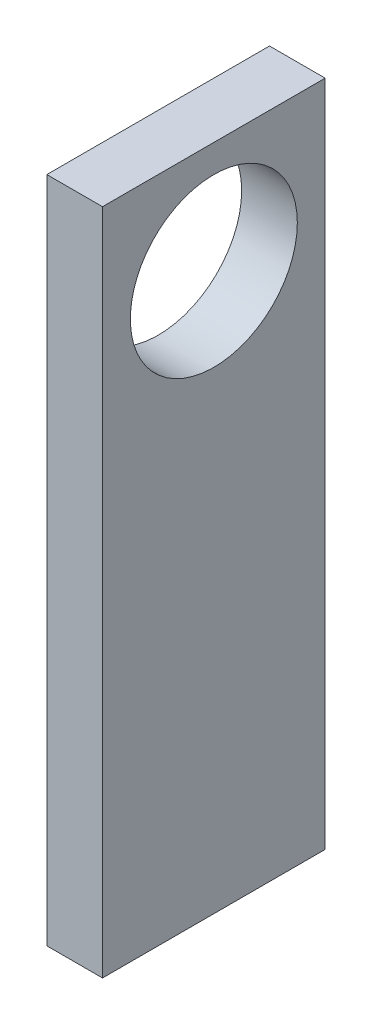
ISO-10303-21;
HEADER;
FILE_DESCRIPTION(('STEP AP214'),'2;1');
FILE_NAME('part.step','',(''),(''),'','','');
FILE_SCHEMA(('AUTOMOTIVE_DESIGN { 1 0 10303 214 1 1 1 1 }'));
ENDSEC;
DATA;
#1=APPLICATION_CONTEXT('core data for automotive mechanical design processes');
#2=APPLICATION_PROTOCOL_DEFINITION('international standard','automotive_design',2000,#1);
#3=PRODUCT_CONTEXT('',#1,'mechanical');
#4=PRODUCT('Part','Part','',(#3));
#5=PRODUCT_RELATED_PRODUCT_CATEGORY('part','',(#4));
#6=PRODUCT_DEFINITION_FORMATION('','',#4);
#7=PRODUCT_DEFINITION_CONTEXT('part definition',#1,'design');
#8=PRODUCT_DEFINITION('design','',#6,#7);
#9=PRODUCT_DEFINITION_SHAPE('','',#8);
#10=(LENGTH_UNIT() NAMED_UNIT(*) SI_UNIT(.MILLI.,.METRE.));
#11=(NAMED_UNIT(*) PLANE_ANGLE_UNIT() SI_UNIT($,.RADIAN.));
#12=(NAMED_UNIT(*) SI_UNIT($,.STERADIAN.) SOLID_ANGLE_UNIT());
#13=UNCERTAINTY_MEASURE_WITH_UNIT(LENGTH_MEASURE(1.E-05),#10,'distance_accuracy_value','');
#14=(GEOMETRIC_REPRESENTATION_CONTEXT(3) GLOBAL_UNCERTAINTY_ASSIGNED_CONTEXT((#13)) GLOBAL_UNIT_ASSIGNED_CONTEXT((#10,
#11,#12)) REPRESENTATION_CONTEXT('',''));
#15=CARTESIAN_POINT('',(0.,0.,0.));
#16=DIRECTION('',(0.,0.,1.));
#17=DIRECTION('',(1.,0.,0.));
#18=AXIS2_PLACEMENT_3D('',#15,#16,#17);
#19=CARTESIAN_POINT('',(5.,0.,0.));
#20=DIRECTION('',(1.,0.,0.));
#21=DIRECTION('',(0.,0.,-1.));
#22=AXIS2_PLACEMENT_3D('',#19,#20,#21);
#23=PLANE('',#22);
#24=DIRECTION('',(0.,-1.,0.));
#25=VECTOR('',#24,1.);
#26=CARTESIAN_POINT('',(5.,-10.,10.));
#27=LINE('',#26,#25);
#28=CARTESIAN_POINT('',(5.,9.99999999999999,10.));
#29=VERTEX_POINT('',#28);
#30=CARTESIAN_POINT('',(5.,-50.,9.99999999999999));
#31=VERTEX_POINT('',#30);
#32=EDGE_CURVE('E82',#29,#31,#27,.T.);
#33=ORIENTED_EDGE('',*,*,#32,.T.);
#34=DIRECTION('',(0.,0.,-1.));
#35=VECTOR('',#34,1.);
#36=CARTESIAN_POINT('',(5.,-50.,9.99999999999999));
#37=LINE('',#36,#35);
#38=CARTESIAN_POINT('',(5.,-50.,-10.));
#39=VERTEX_POINT('',#38);
#40=EDGE_CURVE('E85',#31,#39,#37,.T.);
#41=ORIENTED_EDGE('',*,*,#40,.T.);
#42=DIRECTION('',(0.,1.,0.));
#43=VECTOR('',#42,1.);
#44=CARTESIAN_POINT('',(5.,-50.,-10.));
#45=LINE('',#44,#43);
#46=CARTESIAN_POINT('',(5.,10.,-10.));
#47=VERTEX_POINT('',#46);
#48=EDGE_CURVE('E89',#39,#47,#45,.T.);
#49=ORIENTED_EDGE('',*,*,#48,.T.);
#50=DIRECTION('',(0.,0.,1.));
#51=VECTOR('',#50,1.);
#52=CARTESIAN_POINT('',(5.,10.,-10.));
#53=LINE('',#52,#51);
#54=EDGE_CURVE('E54',#47,#29,#53,.T.);
#55=ORIENTED_EDGE('',*,*,#54,.T.);
#56=EDGE_LOOP('',(#33,#41,#49,#55));
#57=FACE_BOUND('',#56,.T.);
#58=CARTESIAN_POINT('',(5.,0.,0.));
#59=DIRECTION('',(1.,0.,0.));
#60=DIRECTION('',(0.,0.,-1.));
#61=AXIS2_PLACEMENT_3D('',#58,#59,#60);
#62=CIRCLE('',#61,7.5);
#63=CARTESIAN_POINT('',(5.,0.,-7.5));
#64=VERTEX_POINT('',#63);
#65=EDGE_CURVE('E103',#64,#64,#62,.T.);
#66=ORIENTED_EDGE('',*,*,#65,.F.);
#67=EDGE_LOOP('',(#66));
#68=FACE_BOUND('',#67,.T.);
#69=ADVANCED_FACE('F37',(#57,#68),#23,.T.);
#70=CARTESIAN_POINT('',(0.,0.,0.));
#71=DIRECTION('',(1.,0.,0.));
#72=DIRECTION('',(0.,0.,-1.));
#73=AXIS2_PLACEMENT_3D('',#70,#71,#72);
#74=PLANE('',#73);
#75=DIRECTION('',(0.,-1.,0.));
#76=VECTOR('',#75,1.);
#77=CARTESIAN_POINT('',(0.,-10.,10.));
#78=LINE('',#77,#76);
#79=CARTESIAN_POINT('',(0.,9.99999999999999,10.));
#80=VERTEX_POINT('',#79);
#81=CARTESIAN_POINT('',(0.,-50.,9.99999999999999));
#82=VERTEX_POINT('',#81);
#83=EDGE_CURVE('E77',#80,#82,#78,.T.);
#84=ORIENTED_EDGE('',*,*,#83,.F.);
#85=DIRECTION('',(0.,0.,1.));
#86=VECTOR('',#85,1.);
#87=CARTESIAN_POINT('',(0.,10.,-10.));
#88=LINE('',#87,#86);
#89=CARTESIAN_POINT('',(0.,10.,-10.));
#90=VERTEX_POINT('',#89);
#91=EDGE_CURVE('E106',#90,#80,#88,.T.);
#92=ORIENTED_EDGE('',*,*,#91,.F.);
#93=DIRECTION('',(0.,1.,0.));
#94=VECTOR('',#93,1.);
#95=CARTESIAN_POINT('',(0.,-10.,-10.));
#96=LINE('',#95,#94);
#97=CARTESIAN_POINT('',(0.,-50.,-10.));
#98=VERTEX_POINT('',#97);
#99=EDGE_CURVE('E70',#98,#90,#96,.T.);
#100=ORIENTED_EDGE('',*,*,#99,.F.);
#101=DIRECTION('',(0.,0.,-1.));
#102=VECTOR('',#101,1.);
#103=CARTESIAN_POINT('',(0.,-50.,9.99999999999999));
#104=LINE('',#103,#102);
#105=EDGE_CURVE('E94',#82,#98,#104,.T.);
#106=ORIENTED_EDGE('',*,*,#105,.F.);
#107=EDGE_LOOP('',(#84,#92,#100,#106));
#108=FACE_BOUND('',#107,.T.);
#109=CARTESIAN_POINT('',(0.,0.,0.));
#110=DIRECTION('',(1.,0.,0.));
#111=DIRECTION('',(0.,0.,-1.));
#112=AXIS2_PLACEMENT_3D('',#109,#110,#111);
#113=CIRCLE('',#112,7.5);
#114=CARTESIAN_POINT('',(0.,0.,-7.5));
#115=VERTEX_POINT('',#114);
#116=EDGE_CURVE('E118',#115,#115,#113,.T.);
#117=ORIENTED_EDGE('',*,*,#116,.T.);
#118=EDGE_LOOP('',(#117));
#119=FACE_BOUND('',#118,.T.);
#120=ADVANCED_FACE('F112',(#108,#119),#74,.F.);
#121=CARTESIAN_POINT('',(5.,-10.,10.));
#122=DIRECTION('',(0.,0.,-1.));
#123=DIRECTION('',(0.,1.,0.));
#124=AXIS2_PLACEMENT_3D('',#121,#122,#123);
#125=PLANE('',#124);
#126=ORIENTED_EDGE('',*,*,#83,.T.);
#127=DIRECTION('',(-1.,0.,0.));
#128=VECTOR('',#127,1.);
#129=CARTESIAN_POINT('',(5.,-50.,9.99999999999999));
#130=LINE('',#129,#128);
#131=EDGE_CURVE('E11',#31,#82,#130,.T.);
#132=ORIENTED_EDGE('',*,*,#131,.F.);
#133=ORIENTED_EDGE('',*,*,#32,.F.);
#134=DIRECTION('',(-1.,0.,0.));
#135=VECTOR('',#134,1.);
#136=CARTESIAN_POINT('',(5.,9.99999999999999,10.));
#137=LINE('',#136,#135);
#138=EDGE_CURVE('E98',#29,#80,#137,.T.);
#139=ORIENTED_EDGE('',*,*,#138,.T.);
#140=EDGE_LOOP('',(#126,#132,#133,#139));
#141=FACE_BOUND('',#140,.T.);
#142=ADVANCED_FACE('F39',(#141),#125,.F.);
#143=CARTESIAN_POINT('',(5.,-50.,9.99999999999999));
#144=DIRECTION('',(0.,1.,0.));
#145=DIRECTION('',(0.,0.,1.));
#146=AXIS2_PLACEMENT_3D('',#143,#144,#145);
#147=PLANE('',#146);
#148=ORIENTED_EDGE('',*,*,#105,.T.);
#149=DIRECTION('',(-1.,0.,0.));
#150=VECTOR('',#149,1.);
#151=CARTESIAN_POINT('',(5.,-50.,-10.));
#152=LINE('',#151,#150);
#153=EDGE_CURVE('E46',#39,#98,#152,.T.);
#154=ORIENTED_EDGE('',*,*,#153,.F.);
#155=ORIENTED_EDGE('',*,*,#40,.F.);
#156=ORIENTED_EDGE('',*,*,#131,.T.);
#157=EDGE_LOOP('',(#148,#154,#155,#156));
#158=FACE_BOUND('',#157,.T.);
#159=ADVANCED_FACE('F93',(#158),#147,.F.);
#160=CARTESIAN_POINT('',(5.,-10.,-10.));
#161=DIRECTION('',(0.,0.,1.));
#162=DIRECTION('',(1.,0.,0.));
#163=AXIS2_PLACEMENT_3D('',#160,#161,#162);
#164=PLANE('',#163);
#165=ORIENTED_EDGE('',*,*,#99,.T.);
#166=DIRECTION('',(-1.,0.,0.));
#167=VECTOR('',#166,1.);
#168=CARTESIAN_POINT('',(5.,10.,-10.));
#169=LINE('',#168,#167);
#170=EDGE_CURVE('E95',#47,#90,#169,.T.);
#171=ORIENTED_EDGE('',*,*,#170,.F.);
#172=ORIENTED_EDGE('',*,*,#48,.F.);
#173=ORIENTED_EDGE('',*,*,#153,.T.);
#174=EDGE_LOOP('',(#165,#171,#172,#173));
#175=FACE_BOUND('',#174,.T.);
#176=ADVANCED_FACE('F96',(#175),#164,.F.);
#177=CARTESIAN_POINT('',(5.,10.,-10.));
#178=DIRECTION('',(0.,-1.,0.));
#179=DIRECTION('',(0.,0.,-1.));
#180=AXIS2_PLACEMENT_3D('',#177,#178,#179);
#181=PLANE('',#180);
#182=ORIENTED_EDGE('',*,*,#91,.T.);
#183=ORIENTED_EDGE('',*,*,#138,.F.);
#184=ORIENTED_EDGE('',*,*,#54,.F.);
#185=ORIENTED_EDGE('',*,*,#170,.T.);
#186=EDGE_LOOP('',(#182,#183,#184,#185));
#187=FACE_BOUND('',#186,.T.);
#188=ADVANCED_FACE('F111',(#187),#181,.F.);
#189=CARTESIAN_POINT('',(5.,0.,0.));
#190=DIRECTION('',(-1.,0.,0.));
#191=DIRECTION('',(0.,0.,1.));
#192=AXIS2_PLACEMENT_3D('',#189,#190,#191);
#193=CYLINDRICAL_SURFACE('',#192,7.5);
#194=ORIENTED_EDGE('',*,*,#65,.T.);
#195=EDGE_LOOP('',(#194));
#196=FACE_BOUND('',#195,.T.);
#197=ORIENTED_EDGE('',*,*,#116,.F.);
#198=EDGE_LOOP('',(#197));
#199=FACE_BOUND('',#198,.T.);
#200=ADVANCED_FACE('F125',(#196,#199),#193,.F.);
#201=CLOSED_SHELL('',(#69,#120,#142,#159,#176,#188,#200));
#202=MANIFOLD_SOLID_BREP('B2',#201);
#203=ADVANCED_BREP_SHAPE_REPRESENTATION('',(#18,#202),#14);
#204=SHAPE_DEFINITION_REPRESENTATION(#9,#203);
ENDSEC;
END-ISO-10303-21;
